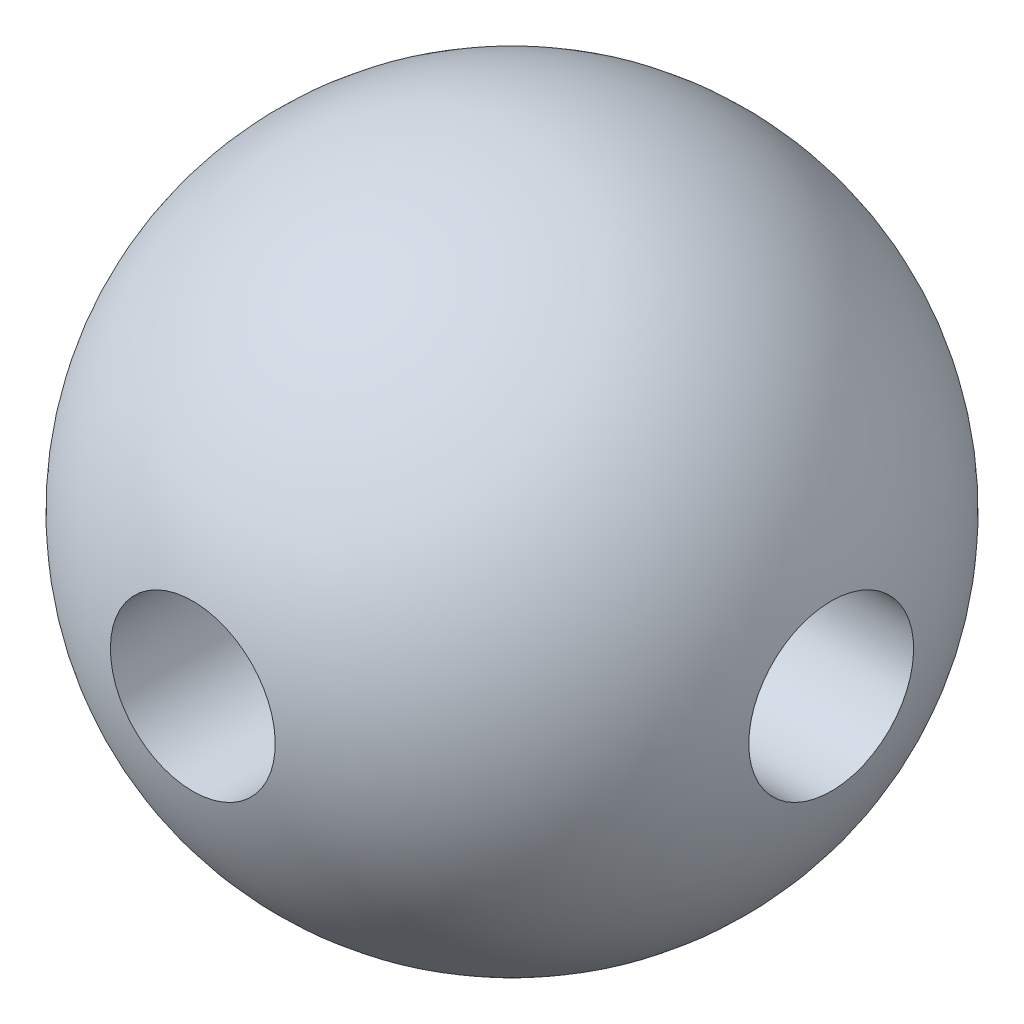
ISO-10303-21;
HEADER;
FILE_DESCRIPTION(('STEP AP214'),'2;1');
FILE_NAME('part.step','',(''),(''),'','','');
FILE_SCHEMA(('AUTOMOTIVE_DESIGN { 1 0 10303 214 1 1 1 1 }'));
ENDSEC;
DATA;
#1=APPLICATION_CONTEXT('core data for automotive mechanical design processes');
#2=APPLICATION_PROTOCOL_DEFINITION('international standard','automotive_design',2000,#1);
#3=PRODUCT_CONTEXT('',#1,'mechanical');
#4=PRODUCT('Part','Part','',(#3));
#5=PRODUCT_RELATED_PRODUCT_CATEGORY('part','',(#4));
#6=PRODUCT_DEFINITION_FORMATION('','',#4);
#7=PRODUCT_DEFINITION_CONTEXT('part definition',#1,'design');
#8=PRODUCT_DEFINITION('design','',#6,#7);
#9=PRODUCT_DEFINITION_SHAPE('','',#8);
#10=(LENGTH_UNIT() NAMED_UNIT(*) SI_UNIT(.MILLI.,.METRE.));
#11=(NAMED_UNIT(*) PLANE_ANGLE_UNIT() SI_UNIT($,.RADIAN.));
#12=(NAMED_UNIT(*) SI_UNIT($,.STERADIAN.) SOLID_ANGLE_UNIT());
#13=UNCERTAINTY_MEASURE_WITH_UNIT(LENGTH_MEASURE(1.E-05),#10,'distance_accuracy_value','');
#14=(GEOMETRIC_REPRESENTATION_CONTEXT(3) GLOBAL_UNCERTAINTY_ASSIGNED_CONTEXT((#13)) GLOBAL_UNIT_ASSIGNED_CONTEXT((#10,
#11,#12)) REPRESENTATION_CONTEXT('',''));
#15=CARTESIAN_POINT('',(0.,0.,0.));
#16=DIRECTION('',(0.,0.,1.));
#17=DIRECTION('',(1.,0.,0.));
#18=AXIS2_PLACEMENT_3D('',#15,#16,#17);
#19=CARTESIAN_POINT('',(-3.,0.,0.));
#20=DIRECTION('',(1.,0.,0.));
#21=DIRECTION('',(0.,0.,-1.));
#22=AXIS2_PLACEMENT_3D('',#19,#20,#21);
#23=CYLINDRICAL_SURFACE('',#22,0.75);
#24=CARTESIAN_POINT('',(2.90473750965556,0.,0.));
#25=DIRECTION('',(-1.,0.,0.));
#26=DIRECTION('',(0.,0.,1.));
#27=AXIS2_PLACEMENT_3D('',#24,#25,#26);
#28=CIRCLE('',#27,0.75);
#29=CARTESIAN_POINT('',(2.90473750965556,0.,0.75));
#30=VERTEX_POINT('',#29);
#31=EDGE_CURVE('E70',#30,#30,#28,.T.);
#32=ORIENTED_EDGE('',*,*,#31,.F.);
#33=EDGE_LOOP('',(#32));
#34=FACE_BOUND('',#33,.T.);
#35=CARTESIAN_POINT('',(0.,0.,0.));
#36=DIRECTION('',(0.707106781186547,0.,-0.707106781186547));
#37=DIRECTION('',(0.707106781186547,0.,0.707106781186547));
#38=AXIS2_PLACEMENT_3D('',#35,#36,#37);
#39=ELLIPSE('',#38,1.06066017177982,0.75);
#40=CARTESIAN_POINT('',(0.,-0.75,0.));
#41=VERTEX_POINT('',#40);
#42=CARTESIAN_POINT('',(0.,0.75,0.));
#43=VERTEX_POINT('',#42);
#44=EDGE_CURVE('E53',#41,#43,#39,.F.);
#45=ORIENTED_EDGE('',*,*,#44,.T.);
#46=CARTESIAN_POINT('',(0.,0.,0.));
#47=DIRECTION('',(0.707106781186547,0.,0.707106781186547));
#48=DIRECTION('',(0.707106781186547,0.,-0.707106781186547));
#49=AXIS2_PLACEMENT_3D('',#46,#47,#48);
#50=ELLIPSE('',#49,1.06066017177982,0.75);
#51=EDGE_CURVE('E11',#43,#41,#50,.F.);
#52=ORIENTED_EDGE('',*,*,#51,.T.);
#53=EDGE_LOOP('',(#45,#52));
#54=FACE_BOUND('',#53,.T.);
#55=ADVANCED_FACE('F39',(#34,#54),#23,.F.);
#56=CARTESIAN_POINT('',(0.,0.,0.));
#57=DIRECTION('',(0.,1.,0.));
#58=DIRECTION('',(1.,0.,0.));
#59=AXIS2_PLACEMENT_3D('',#56,#57,#58);
#60=SPHERICAL_SURFACE('',#59,3.);
#61=CARTESIAN_POINT('',(0.,0.,2.90473750965556));
#62=DIRECTION('',(0.,0.,-1.));
#63=DIRECTION('',(-1.,0.,0.));
#64=AXIS2_PLACEMENT_3D('',#61,#62,#63);
#65=CIRCLE('',#64,0.75);
#66=CARTESIAN_POINT('',(-0.75,0.,2.90473750965556));
#67=VERTEX_POINT('',#66);
#68=EDGE_CURVE('E83',#67,#67,#65,.T.);
#69=ORIENTED_EDGE('',*,*,#68,.T.);
#70=EDGE_LOOP('',(#69));
#71=FACE_BOUND('',#70,.T.);
#72=CARTESIAN_POINT('',(0.,0.,-2.90473750965556));
#73=DIRECTION('',(0.,0.,1.));
#74=DIRECTION('',(1.,0.,0.));
#75=AXIS2_PLACEMENT_3D('',#72,#73,#74);
#76=CIRCLE('',#75,0.75);
#77=CARTESIAN_POINT('',(0.75,0.,-2.90473750965556));
#78=VERTEX_POINT('',#77);
#79=EDGE_CURVE('E87',#78,#78,#76,.T.);
#80=ORIENTED_EDGE('',*,*,#79,.T.);
#81=EDGE_LOOP('',(#80));
#82=FACE_BOUND('',#81,.T.);
#83=ORIENTED_EDGE('',*,*,#31,.T.);
#84=EDGE_LOOP('',(#83));
#85=FACE_BOUND('',#84,.T.);
#86=CARTESIAN_POINT('',(-2.90473750965556,0.,0.));
#87=DIRECTION('',(1.,0.,0.));
#88=DIRECTION('',(0.,0.,-1.));
#89=AXIS2_PLACEMENT_3D('',#86,#87,#88);
#90=CIRCLE('',#89,0.75);
#91=CARTESIAN_POINT('',(-2.90473750965556,0.,-0.75));
#92=VERTEX_POINT('',#91);
#93=EDGE_CURVE('E79',#92,#92,#90,.T.);
#94=ORIENTED_EDGE('',*,*,#93,.T.);
#95=EDGE_LOOP('',(#94));
#96=FACE_BOUND('',#95,.T.);
#97=ADVANCED_FACE('F41',(#71,#82,#85,#96),#60,.T.);
#98=CARTESIAN_POINT('',(0.,0.,0.));
#99=DIRECTION('',(0.707106781186547,0.,-0.707106781186547));
#100=DIRECTION('',(0.707106781186547,0.,0.707106781186547));
#101=AXIS2_PLACEMENT_3D('',#98,#99,#100);
#102=ELLIPSE('',#101,1.06066017177982,0.75);
#103=EDGE_CURVE('E59',#41,#43,#102,.T.);
#104=ORIENTED_EDGE('',*,*,#103,.T.);
#105=CARTESIAN_POINT('',(0.,0.,0.));
#106=DIRECTION('',(0.707106781186547,0.,0.707106781186547));
#107=DIRECTION('',(0.707106781186547,0.,-0.707106781186547));
#108=AXIS2_PLACEMENT_3D('',#105,#106,#107);
#109=ELLIPSE('',#108,1.06066017177982,0.75);
#110=EDGE_CURVE('E48',#43,#41,#109,.T.);
#111=ORIENTED_EDGE('',*,*,#110,.T.);
#112=EDGE_LOOP('',(#104,#111));
#113=FACE_BOUND('',#112,.T.);
#114=ORIENTED_EDGE('',*,*,#93,.F.);
#115=EDGE_LOOP('',(#114));
#116=FACE_BOUND('',#115,.T.);
#117=ADVANCED_FACE('F72',(#113,#116),#23,.F.);
#118=CARTESIAN_POINT('',(0.,0.,-3.));
#119=DIRECTION('',(0.,0.,1.));
#120=DIRECTION('',(1.,0.,0.));
#121=AXIS2_PLACEMENT_3D('',#118,#119,#120);
#122=CYLINDRICAL_SURFACE('',#121,0.75);
#123=ORIENTED_EDGE('',*,*,#44,.F.);
#124=ORIENTED_EDGE('',*,*,#110,.F.);
#125=EDGE_LOOP('',(#123,#124));
#126=FACE_BOUND('',#125,.T.);
#127=ORIENTED_EDGE('',*,*,#68,.F.);
#128=EDGE_LOOP('',(#127));
#129=FACE_BOUND('',#128,.T.);
#130=ADVANCED_FACE('F67',(#126,#129),#122,.F.);
#131=ORIENTED_EDGE('',*,*,#103,.F.);
#132=ORIENTED_EDGE('',*,*,#51,.F.);
#133=EDGE_LOOP('',(#131,#132));
#134=FACE_BOUND('',#133,.T.);
#135=ORIENTED_EDGE('',*,*,#79,.F.);
#136=EDGE_LOOP('',(#135));
#137=FACE_BOUND('',#136,.T.);
#138=ADVANCED_FACE('F60',(#134,#137),#122,.F.);
#139=CLOSED_SHELL('',(#55,#97,#117,#130,#138));
#140=MANIFOLD_SOLID_BREP('B2',#139);
#141=ADVANCED_BREP_SHAPE_REPRESENTATION('',(#18,#140),#14);
#142=SHAPE_DEFINITION_REPRESENTATION(#9,#141);
ENDSEC;
END-ISO-10303-21;
